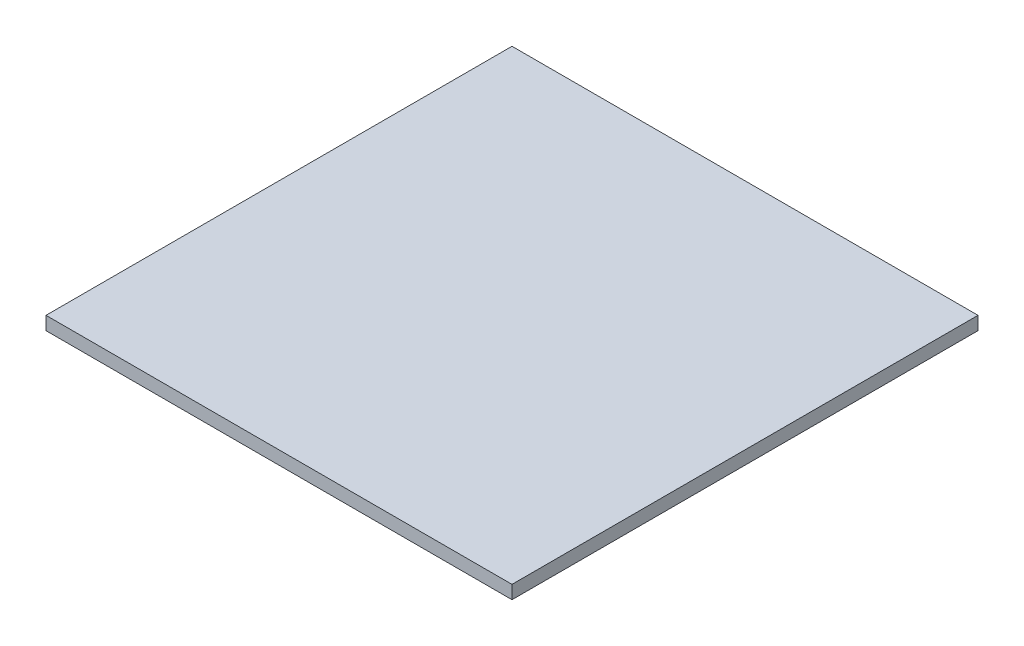
ISO-10303-21;
HEADER;
FILE_DESCRIPTION(('STEP AP214'),'2;1');
FILE_NAME('part.step','',(''),(''),'','','');
FILE_SCHEMA(('AUTOMOTIVE_DESIGN { 1 0 10303 214 1 1 1 1 }'));
ENDSEC;
DATA;
#1=APPLICATION_CONTEXT('core data for automotive mechanical design processes');
#2=APPLICATION_PROTOCOL_DEFINITION('international standard','automotive_design',2000,#1);
#3=PRODUCT_CONTEXT('',#1,'mechanical');
#4=PRODUCT('Part','Part','',(#3));
#5=PRODUCT_RELATED_PRODUCT_CATEGORY('part','',(#4));
#6=PRODUCT_DEFINITION_FORMATION('','',#4);
#7=PRODUCT_DEFINITION_CONTEXT('part definition',#1,'design');
#8=PRODUCT_DEFINITION('design','',#6,#7);
#9=PRODUCT_DEFINITION_SHAPE('','',#8);
#10=(LENGTH_UNIT() NAMED_UNIT(*) SI_UNIT(.MILLI.,.METRE.));
#11=(NAMED_UNIT(*) PLANE_ANGLE_UNIT() SI_UNIT($,.RADIAN.));
#12=(NAMED_UNIT(*) SI_UNIT($,.STERADIAN.) SOLID_ANGLE_UNIT());
#13=UNCERTAINTY_MEASURE_WITH_UNIT(LENGTH_MEASURE(1.E-05),#10,'distance_accuracy_value','');
#14=(GEOMETRIC_REPRESENTATION_CONTEXT(3) GLOBAL_UNCERTAINTY_ASSIGNED_CONTEXT((#13)) GLOBAL_UNIT_ASSIGNED_CONTEXT((#10,
#11,#12)) REPRESENTATION_CONTEXT('',''));
#15=CARTESIAN_POINT('',(0.,0.,0.));
#16=DIRECTION('',(0.,0.,1.));
#17=DIRECTION('',(1.,0.,0.));
#18=AXIS2_PLACEMENT_3D('',#15,#16,#17);
#19=CARTESIAN_POINT('',(-143.006134969325,8.,53.0368098159509));
#20=DIRECTION('',(1.,0.,0.));
#21=DIRECTION('',(0.,0.,-1.));
#22=AXIS2_PLACEMENT_3D('',#19,#20,#21);
#23=PLANE('',#22);
#24=DIRECTION('',(0.,0.,1.));
#25=VECTOR('',#24,1.);
#26=CARTESIAN_POINT('',(-143.006134969325,0.,53.0368098159509));
#27=LINE('',#26,#25);
#28=CARTESIAN_POINT('',(-143.006134969325,0.,-226.963190184049));
#29=VERTEX_POINT('',#28);
#30=CARTESIAN_POINT('',(-143.006134969325,0.,53.0368098159509));
#31=VERTEX_POINT('',#30);
#32=EDGE_CURVE('E95',#29,#31,#27,.T.);
#33=ORIENTED_EDGE('',*,*,#32,.T.);
#34=DIRECTION('',(0.,-1.,0.));
#35=VECTOR('',#34,1.);
#36=CARTESIAN_POINT('',(-143.006134969325,8.,53.0368098159509));
#37=LINE('',#36,#35);
#38=CARTESIAN_POINT('',(-143.006134969325,8.,53.0368098159509));
#39=VERTEX_POINT('',#38);
#40=EDGE_CURVE('E11',#39,#31,#37,.T.);
#41=ORIENTED_EDGE('',*,*,#40,.F.);
#42=DIRECTION('',(0.,0.,1.));
#43=VECTOR('',#42,1.);
#44=CARTESIAN_POINT('',(-143.006134969325,8.,53.0368098159509));
#45=LINE('',#44,#43);
#46=CARTESIAN_POINT('',(-143.006134969325,8.,-226.963190184049));
#47=VERTEX_POINT('',#46);
#48=EDGE_CURVE('E83',#47,#39,#45,.T.);
#49=ORIENTED_EDGE('',*,*,#48,.F.);
#50=DIRECTION('',(0.,-1.,0.));
#51=VECTOR('',#50,1.);
#52=CARTESIAN_POINT('',(-143.006134969325,8.,-226.963190184049));
#53=LINE('',#52,#51);
#54=EDGE_CURVE('E91',#47,#29,#53,.T.);
#55=ORIENTED_EDGE('',*,*,#54,.T.);
#56=EDGE_LOOP('',(#33,#41,#49,#55));
#57=FACE_BOUND('',#56,.T.);
#58=ADVANCED_FACE('F32',(#57),#23,.F.);
#59=CARTESIAN_POINT('',(-143.006134969325,8.,53.0368098159509));
#60=DIRECTION('',(0.,0.,-1.));
#61=DIRECTION('',(-1.,0.,0.));
#62=AXIS2_PLACEMENT_3D('',#59,#60,#61);
#63=PLANE('',#62);
#64=DIRECTION('',(1.,0.,0.));
#65=VECTOR('',#64,1.);
#66=CARTESIAN_POINT('',(-143.006134969325,0.,53.0368098159509));
#67=LINE('',#66,#65);
#68=CARTESIAN_POINT('',(136.993865030675,0.,53.0368098159509));
#69=VERTEX_POINT('',#68);
#70=EDGE_CURVE('E87',#31,#69,#67,.T.);
#71=ORIENTED_EDGE('',*,*,#70,.T.);
#72=DIRECTION('',(0.,-1.,0.));
#73=VECTOR('',#72,1.);
#74=CARTESIAN_POINT('',(136.993865030675,8.,53.0368098159509));
#75=LINE('',#74,#73);
#76=CARTESIAN_POINT('',(136.993865030675,8.,53.0368098159509));
#77=VERTEX_POINT('',#76);
#78=EDGE_CURVE('E40',#77,#69,#75,.T.);
#79=ORIENTED_EDGE('',*,*,#78,.F.);
#80=DIRECTION('',(1.,0.,0.));
#81=VECTOR('',#80,1.);
#82=CARTESIAN_POINT('',(-143.006134969325,8.,53.0368098159509));
#83=LINE('',#82,#81);
#84=EDGE_CURVE('E78',#39,#77,#83,.T.);
#85=ORIENTED_EDGE('',*,*,#84,.F.);
#86=ORIENTED_EDGE('',*,*,#40,.T.);
#87=EDGE_LOOP('',(#71,#79,#85,#86));
#88=FACE_BOUND('',#87,.T.);
#89=ADVANCED_FACE('F86',(#88),#63,.F.);
#90=CARTESIAN_POINT('',(136.993865030675,8.,53.0368098159509));
#91=DIRECTION('',(-1.,0.,0.));
#92=DIRECTION('',(0.,0.,1.));
#93=AXIS2_PLACEMENT_3D('',#90,#91,#92);
#94=PLANE('',#93);
#95=DIRECTION('',(0.,0.,-1.));
#96=VECTOR('',#95,1.);
#97=CARTESIAN_POINT('',(136.993865030675,0.,53.0368098159509));
#98=LINE('',#97,#96);
#99=CARTESIAN_POINT('',(136.993865030675,0.,-226.963190184049));
#100=VERTEX_POINT('',#99);
#101=EDGE_CURVE('E65',#69,#100,#98,.T.);
#102=ORIENTED_EDGE('',*,*,#101,.T.);
#103=DIRECTION('',(0.,-1.,0.));
#104=VECTOR('',#103,1.);
#105=CARTESIAN_POINT('',(136.993865030675,8.,-226.963190184049));
#106=LINE('',#105,#104);
#107=CARTESIAN_POINT('',(136.993865030675,8.,-226.963190184049));
#108=VERTEX_POINT('',#107);
#109=EDGE_CURVE('E88',#108,#100,#106,.T.);
#110=ORIENTED_EDGE('',*,*,#109,.F.);
#111=DIRECTION('',(0.,0.,-1.));
#112=VECTOR('',#111,1.);
#113=CARTESIAN_POINT('',(136.993865030675,8.,53.0368098159509));
#114=LINE('',#113,#112);
#115=EDGE_CURVE('E81',#77,#108,#114,.T.);
#116=ORIENTED_EDGE('',*,*,#115,.F.);
#117=ORIENTED_EDGE('',*,*,#78,.T.);
#118=EDGE_LOOP('',(#102,#110,#116,#117));
#119=FACE_BOUND('',#118,.T.);
#120=ADVANCED_FACE('F89',(#119),#94,.F.);
#121=CARTESIAN_POINT('',(-143.006134969325,8.,-226.963190184049));
#122=DIRECTION('',(0.,0.,1.));
#123=DIRECTION('',(1.,0.,0.));
#124=AXIS2_PLACEMENT_3D('',#121,#122,#123);
#125=PLANE('',#124);
#126=DIRECTION('',(-1.,0.,0.));
#127=VECTOR('',#126,1.);
#128=CARTESIAN_POINT('',(-143.006134969325,0.,-226.963190184049));
#129=LINE('',#128,#127);
#130=EDGE_CURVE('E71',#100,#29,#129,.T.);
#131=ORIENTED_EDGE('',*,*,#130,.T.);
#132=ORIENTED_EDGE('',*,*,#54,.F.);
#133=DIRECTION('',(-1.,0.,0.));
#134=VECTOR('',#133,1.);
#135=CARTESIAN_POINT('',(-143.006134969325,8.,-226.963190184049));
#136=LINE('',#135,#134);
#137=EDGE_CURVE('E48',#108,#47,#136,.T.);
#138=ORIENTED_EDGE('',*,*,#137,.F.);
#139=ORIENTED_EDGE('',*,*,#109,.T.);
#140=EDGE_LOOP('',(#131,#132,#138,#139));
#141=FACE_BOUND('',#140,.T.);
#142=ADVANCED_FACE('F102',(#141),#125,.F.);
#143=CARTESIAN_POINT('',(0.,8.,0.));
#144=DIRECTION('',(0.,-1.,0.));
#145=DIRECTION('',(0.,0.,-1.));
#146=AXIS2_PLACEMENT_3D('',#143,#144,#145);
#147=PLANE('',#146);
#148=ORIENTED_EDGE('',*,*,#48,.T.);
#149=ORIENTED_EDGE('',*,*,#84,.T.);
#150=ORIENTED_EDGE('',*,*,#115,.T.);
#151=ORIENTED_EDGE('',*,*,#137,.T.);
#152=EDGE_LOOP('',(#148,#149,#150,#151));
#153=FACE_BOUND('',#152,.T.);
#154=ADVANCED_FACE('F79',(#153),#147,.F.);
#155=CARTESIAN_POINT('',(0.,0.,0.));
#156=DIRECTION('',(0.,-1.,0.));
#157=DIRECTION('',(0.,0.,-1.));
#158=AXIS2_PLACEMENT_3D('',#155,#156,#157);
#159=PLANE('',#158);
#160=ORIENTED_EDGE('',*,*,#32,.F.);
#161=ORIENTED_EDGE('',*,*,#130,.F.);
#162=ORIENTED_EDGE('',*,*,#101,.F.);
#163=ORIENTED_EDGE('',*,*,#70,.F.);
#164=EDGE_LOOP('',(#160,#161,#162,#163));
#165=FACE_BOUND('',#164,.T.);
#166=ADVANCED_FACE('F105',(#165),#159,.T.);
#167=CLOSED_SHELL('',(#58,#89,#120,#142,#154,#166));
#168=MANIFOLD_SOLID_BREP('B2',#167);
#169=ADVANCED_BREP_SHAPE_REPRESENTATION('',(#18,#168),#14);
#170=SHAPE_DEFINITION_REPRESENTATION(#9,#169);
ENDSEC;
END-ISO-10303-21;
